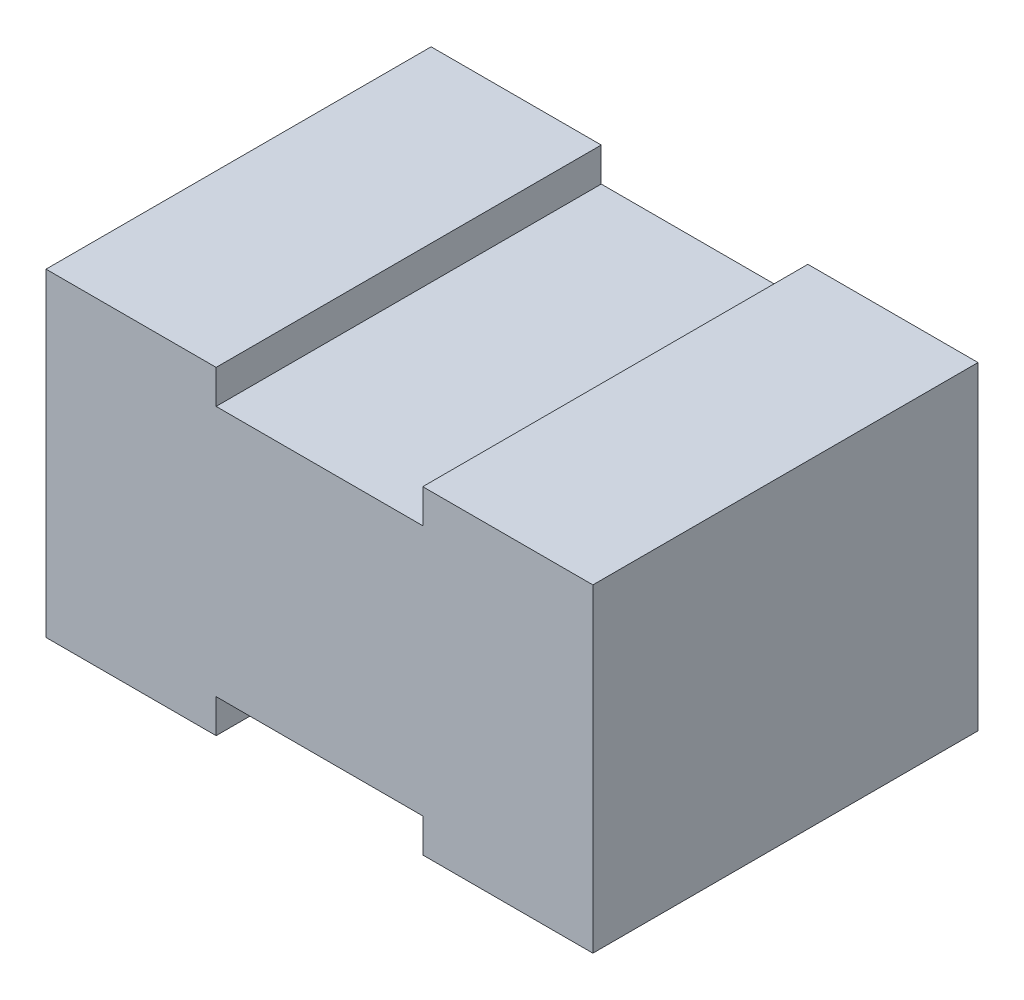
ISO-10303-21;
HEADER;
FILE_DESCRIPTION(('STEP AP214'),'2;1');
FILE_NAME('part.step','',(''),(''),'','','');
FILE_SCHEMA(('AUTOMOTIVE_DESIGN { 1 0 10303 214 1 1 1 1 }'));
ENDSEC;
DATA;
#1=APPLICATION_CONTEXT('core data for automotive mechanical design processes');
#2=APPLICATION_PROTOCOL_DEFINITION('international standard','automotive_design',2000,#1);
#3=PRODUCT_CONTEXT('',#1,'mechanical');
#4=PRODUCT('Part','Part','',(#3));
#5=PRODUCT_RELATED_PRODUCT_CATEGORY('part','',(#4));
#6=PRODUCT_DEFINITION_FORMATION('','',#4);
#7=PRODUCT_DEFINITION_CONTEXT('part definition',#1,'design');
#8=PRODUCT_DEFINITION('design','',#6,#7);
#9=PRODUCT_DEFINITION_SHAPE('','',#8);
#10=(LENGTH_UNIT() NAMED_UNIT(*) SI_UNIT(.MILLI.,.METRE.));
#11=(NAMED_UNIT(*) PLANE_ANGLE_UNIT() SI_UNIT($,.RADIAN.));
#12=(NAMED_UNIT(*) SI_UNIT($,.STERADIAN.) SOLID_ANGLE_UNIT());
#13=UNCERTAINTY_MEASURE_WITH_UNIT(LENGTH_MEASURE(1.E-05),#10,'distance_accuracy_value','');
#14=(GEOMETRIC_REPRESENTATION_CONTEXT(3) GLOBAL_UNCERTAINTY_ASSIGNED_CONTEXT((#13)) GLOBAL_UNIT_ASSIGNED_CONTEXT((#10,
#11,#12)) REPRESENTATION_CONTEXT('',''));
#15=CARTESIAN_POINT('',(0.,0.,0.));
#16=DIRECTION('',(0.,0.,1.));
#17=DIRECTION('',(1.,0.,0.));
#18=AXIS2_PLACEMENT_3D('',#15,#16,#17);
#19=CARTESIAN_POINT('',(0.,0.,0.45999908));
#20=DIRECTION('',(0.,0.,1.));
#21=DIRECTION('',(1.,0.,0.));
#22=AXIS2_PLACEMENT_3D('',#19,#20,#21);
#23=PLANE('',#22);
#24=DIRECTION('',(1.,0.,0.));
#25=VECTOR('',#24,1.);
#26=CARTESIAN_POINT('',(-0.12340082,0.15009876,0.459999080498));
#27=LINE('',#26,#25);
#28=CARTESIAN_POINT('',(-0.12340082,0.15009876,0.459999080498));
#29=VERTEX_POINT('',#28);
#30=CARTESIAN_POINT('',(0.12340082,0.15009876,0.459999080498));
#31=VERTEX_POINT('',#30);
#32=EDGE_CURVE('E223',#29,#31,#27,.T.);
#33=ORIENTED_EDGE('',*,*,#32,.F.);
#34=DIRECTION('',(0.,-1.,0.));
#35=VECTOR('',#34,1.);
#36=CARTESIAN_POINT('',(-0.12340082,0.1905,0.459999080498));
#37=LINE('',#36,#35);
#38=CARTESIAN_POINT('',(-0.12340082,0.1905,0.459999080498));
#39=VERTEX_POINT('',#38);
#40=EDGE_CURVE('E222',#39,#29,#37,.T.);
#41=ORIENTED_EDGE('',*,*,#40,.F.);
#42=DIRECTION('',(1.,0.,0.));
#43=VECTOR('',#42,1.);
#44=CARTESIAN_POINT('',(-0.32660082,0.1905,0.459999080498));
#45=LINE('',#44,#43);
#46=CARTESIAN_POINT('',(-0.32660082,0.1905,0.459999080498));
#47=VERTEX_POINT('',#46);
#48=EDGE_CURVE('E72',#47,#39,#45,.T.);
#49=ORIENTED_EDGE('',*,*,#48,.F.);
#50=DIRECTION('',(0.,1.,0.));
#51=VECTOR('',#50,1.);
#52=CARTESIAN_POINT('',(-0.32660082,-0.1905,0.459999080498));
#53=LINE('',#52,#51);
#54=CARTESIAN_POINT('',(-0.32660082,-0.1905,0.459999080498));
#55=VERTEX_POINT('',#54);
#56=EDGE_CURVE('E59',#55,#47,#53,.T.);
#57=ORIENTED_EDGE('',*,*,#56,.F.);
#58=DIRECTION('',(-1.,0.,0.));
#59=VECTOR('',#58,1.);
#60=CARTESIAN_POINT('',(-0.12340082,-0.1905,0.459999080498));
#61=LINE('',#60,#59);
#62=CARTESIAN_POINT('',(-0.12340082,-0.1905,0.459999080498));
#63=VERTEX_POINT('',#62);
#64=EDGE_CURVE('E240',#63,#55,#61,.T.);
#65=ORIENTED_EDGE('',*,*,#64,.F.);
#66=DIRECTION('',(0.,-1.,0.));
#67=VECTOR('',#66,1.);
#68=CARTESIAN_POINT('',(-0.12340082,-0.15009876,0.459999080498));
#69=LINE('',#68,#67);
#70=CARTESIAN_POINT('',(-0.12340082,-0.15009876,0.459999080498));
#71=VERTEX_POINT('',#70);
#72=EDGE_CURVE('E216',#71,#63,#69,.T.);
#73=ORIENTED_EDGE('',*,*,#72,.F.);
#74=DIRECTION('',(-1.,0.,0.));
#75=VECTOR('',#74,1.);
#76=CARTESIAN_POINT('',(0.12340082,-0.15009876,0.459999080498));
#77=LINE('',#76,#75);
#78=CARTESIAN_POINT('',(0.12340082,-0.15009876,0.459999080498));
#79=VERTEX_POINT('',#78);
#80=EDGE_CURVE('E154',#79,#71,#77,.T.);
#81=ORIENTED_EDGE('',*,*,#80,.F.);
#82=DIRECTION('',(0.,1.,0.));
#83=VECTOR('',#82,1.);
#84=CARTESIAN_POINT('',(0.12340082,-0.1905,0.459999080498));
#85=LINE('',#84,#83);
#86=CARTESIAN_POINT('',(0.12340082,-0.1905,0.459999080498));
#87=VERTEX_POINT('',#86);
#88=EDGE_CURVE('E149',#87,#79,#85,.T.);
#89=ORIENTED_EDGE('',*,*,#88,.F.);
#90=DIRECTION('',(-1.,0.,0.));
#91=VECTOR('',#90,1.);
#92=CARTESIAN_POINT('',(0.32660082,-0.1905,0.459999080498));
#93=LINE('',#92,#91);
#94=CARTESIAN_POINT('',(0.32660082,-0.1905,0.459999080498));
#95=VERTEX_POINT('',#94);
#96=EDGE_CURVE('E11',#95,#87,#93,.T.);
#97=ORIENTED_EDGE('',*,*,#96,.F.);
#98=DIRECTION('',(0.,-1.,0.));
#99=VECTOR('',#98,1.);
#100=CARTESIAN_POINT('',(0.32660082,0.190499999707,0.459999080498));
#101=LINE('',#100,#99);
#102=CARTESIAN_POINT('',(0.32660082,0.190499999707,0.459999080498));
#103=VERTEX_POINT('',#102);
#104=EDGE_CURVE('E183',#103,#95,#101,.T.);
#105=ORIENTED_EDGE('',*,*,#104,.F.);
#106=DIRECTION('',(1.,-1.441929198527E-09,0.));
#107=VECTOR('',#106,1.);
#108=CARTESIAN_POINT('',(0.12340082,0.1905,0.459999080498));
#109=LINE('',#108,#107);
#110=CARTESIAN_POINT('',(0.12340082,0.1905,0.459999080498));
#111=VERTEX_POINT('',#110);
#112=EDGE_CURVE('E187',#111,#103,#109,.T.);
#113=ORIENTED_EDGE('',*,*,#112,.F.);
#114=DIRECTION('',(0.,1.,0.));
#115=VECTOR('',#114,1.);
#116=CARTESIAN_POINT('',(0.12340082,0.15009876,0.459999080498));
#117=LINE('',#116,#115);
#118=EDGE_CURVE('E198',#31,#111,#117,.T.);
#119=ORIENTED_EDGE('',*,*,#118,.F.);
#120=EDGE_LOOP('',(#33,#41,#49,#57,#65,#73,#81,#89,#97,#105,#113,#119));
#121=FACE_BOUND('',#120,.T.);
#122=ADVANCED_FACE('F18',(#121),#23,.T.);
#123=CARTESIAN_POINT('',(0.12340082,-0.1905,0.));
#124=DIRECTION('',(0.,-1.,0.));
#125=DIRECTION('',(0.,0.,-1.));
#126=AXIS2_PLACEMENT_3D('',#123,#124,#125);
#127=PLANE('',#126);
#128=ORIENTED_EDGE('',*,*,#96,.T.);
#129=DIRECTION('',(3.036237963113E-10,-3.565224088822E-10,-1.));
#130=VECTOR('',#129,1.);
#131=CARTESIAN_POINT('',(0.12340082,-0.1905,0.459999080498));
#132=LINE('',#131,#130);
#133=CARTESIAN_POINT('',(0.1234008201397,-0.190500000164,0.));
#134=VERTEX_POINT('',#133);
#135=EDGE_CURVE('E29',#87,#134,#132,.T.);
#136=ORIENTED_EDGE('',*,*,#135,.T.);
#137=DIRECTION('',(-1.,0.,0.));
#138=VECTOR('',#137,1.);
#139=CARTESIAN_POINT('',(0.326600819942,-0.190500000164,0.));
#140=LINE('',#139,#138);
#141=CARTESIAN_POINT('',(0.326600819942,-0.190500000164,0.));
#142=VERTEX_POINT('',#141);
#143=EDGE_CURVE('E170',#142,#134,#140,.T.);
#144=ORIENTED_EDGE('',*,*,#143,.F.);
#145=DIRECTION('',(-1.260871948568E-10,-3.565224088822E-10,-1.));
#146=VECTOR('',#145,1.);
#147=CARTESIAN_POINT('',(0.32660082,-0.1905,0.459999080498));
#148=LINE('',#147,#146);
#149=EDGE_CURVE('E185',#95,#142,#148,.T.);
#150=ORIENTED_EDGE('',*,*,#149,.F.);
#151=EDGE_LOOP('',(#128,#136,#144,#150));
#152=FACE_BOUND('',#151,.T.);
#153=ADVANCED_FACE('F395',(#152),#127,.T.);
#154=CARTESIAN_POINT('',(0.12340082,-0.15009876,0.));
#155=DIRECTION('',(-1.,0.,0.));
#156=DIRECTION('',(0.,0.,1.));
#157=AXIS2_PLACEMENT_3D('',#154,#155,#156);
#158=PLANE('',#157);
#159=ORIENTED_EDGE('',*,*,#88,.T.);
#160=DIRECTION('',(3.036237963113E-10,2.311598773503E-10,-1.));
#161=VECTOR('',#160,1.);
#162=CARTESIAN_POINT('',(0.12340082,-0.15009876,0.459999080498));
#163=LINE('',#162,#161);
#164=CARTESIAN_POINT('',(0.1234008201397,-0.1500987598937,0.));
#165=VERTEX_POINT('',#164);
#166=EDGE_CURVE('E142',#79,#165,#163,.T.);
#167=ORIENTED_EDGE('',*,*,#166,.T.);
#168=DIRECTION('',(0.,1.,0.));
#169=VECTOR('',#168,1.);
#170=CARTESIAN_POINT('',(0.1234008201397,-0.190500000164,0.));
#171=LINE('',#170,#169);
#172=EDGE_CURVE('E146',#134,#165,#171,.T.);
#173=ORIENTED_EDGE('',*,*,#172,.F.);
#174=ORIENTED_EDGE('',*,*,#135,.F.);
#175=EDGE_LOOP('',(#159,#167,#173,#174));
#176=FACE_BOUND('',#175,.T.);
#177=ADVANCED_FACE('F144',(#176),#158,.T.);
#178=CARTESIAN_POINT('',(-0.12340082,-0.15009876,0.));
#179=DIRECTION('',(0.,-1.,0.));
#180=DIRECTION('',(0.,0.,-1.));
#181=AXIS2_PLACEMENT_3D('',#178,#179,#180);
#182=PLANE('',#181);
#183=ORIENTED_EDGE('',*,*,#80,.T.);
#184=DIRECTION('',(-3.036237963113E-10,2.311598773503E-10,-1.));
#185=VECTOR('',#184,1.);
#186=CARTESIAN_POINT('',(-0.12340082,-0.15009876,0.459999080498));
#187=LINE('',#186,#185);
#188=CARTESIAN_POINT('',(-0.1234008201397,-0.1500987598937,0.));
#189=VERTEX_POINT('',#188);
#190=EDGE_CURVE('E160',#71,#189,#187,.T.);
#191=ORIENTED_EDGE('',*,*,#190,.T.);
#192=DIRECTION('',(-1.,0.,0.));
#193=VECTOR('',#192,1.);
#194=CARTESIAN_POINT('',(0.1234008201397,-0.1500987598937,0.));
#195=LINE('',#194,#193);
#196=EDGE_CURVE('E157',#165,#189,#195,.T.);
#197=ORIENTED_EDGE('',*,*,#196,.F.);
#198=ORIENTED_EDGE('',*,*,#166,.F.);
#199=EDGE_LOOP('',(#183,#191,#197,#198));
#200=FACE_BOUND('',#199,.T.);
#201=ADVANCED_FACE('F158',(#200),#182,.T.);
#202=CARTESIAN_POINT('',(-0.12340082,-0.1905,0.));
#203=DIRECTION('',(1.,0.,0.));
#204=DIRECTION('',(0.,1.,0.));
#205=AXIS2_PLACEMENT_3D('',#202,#203,#204);
#206=PLANE('',#205);
#207=ORIENTED_EDGE('',*,*,#72,.T.);
#208=DIRECTION('',(-3.036237963113E-10,-3.565224088822E-10,-1.));
#209=VECTOR('',#208,1.);
#210=CARTESIAN_POINT('',(-0.12340082,-0.1905,0.459999080498));
#211=LINE('',#210,#209);
#212=CARTESIAN_POINT('',(-0.1234008201397,-0.190500000164,0.));
#213=VERTEX_POINT('',#212);
#214=EDGE_CURVE('E213',#63,#213,#211,.T.);
#215=ORIENTED_EDGE('',*,*,#214,.T.);
#216=DIRECTION('',(0.,-1.,0.));
#217=VECTOR('',#216,1.);
#218=CARTESIAN_POINT('',(-0.1234008201397,-0.1500987598937,0.));
#219=LINE('',#218,#217);
#220=EDGE_CURVE('E165',#189,#213,#219,.T.);
#221=ORIENTED_EDGE('',*,*,#220,.F.);
#222=ORIENTED_EDGE('',*,*,#190,.F.);
#223=EDGE_LOOP('',(#207,#215,#221,#222));
#224=FACE_BOUND('',#223,.T.);
#225=ADVANCED_FACE('F330',(#224),#206,.T.);
#226=CARTESIAN_POINT('',(-0.32660082,-0.1905,0.));
#227=DIRECTION('',(0.,-1.,0.));
#228=DIRECTION('',(0.,0.,-1.));
#229=AXIS2_PLACEMENT_3D('',#226,#227,#228);
#230=PLANE('',#229);
#231=ORIENTED_EDGE('',*,*,#64,.T.);
#232=DIRECTION('',(1.260871948568E-10,-3.565224088822E-10,-1.));
#233=VECTOR('',#232,1.);
#234=CARTESIAN_POINT('',(-0.32660082,-0.1905,0.459999080498));
#235=LINE('',#234,#233);
#236=CARTESIAN_POINT('',(-0.326600819942,-0.190500000164,0.));
#237=VERTEX_POINT('',#236);
#238=EDGE_CURVE('E243',#55,#237,#235,.T.);
#239=ORIENTED_EDGE('',*,*,#238,.T.);
#240=DIRECTION('',(-1.,0.,0.));
#241=VECTOR('',#240,1.);
#242=CARTESIAN_POINT('',(-0.1234008201397,-0.190500000164,0.));
#243=LINE('',#242,#241);
#244=EDGE_CURVE('E214',#213,#237,#243,.T.);
#245=ORIENTED_EDGE('',*,*,#244,.F.);
#246=ORIENTED_EDGE('',*,*,#214,.F.);
#247=EDGE_LOOP('',(#231,#239,#245,#246));
#248=FACE_BOUND('',#247,.T.);
#249=ADVANCED_FACE('F323',(#248),#230,.T.);
#250=CARTESIAN_POINT('',(-0.32660082,0.1905,0.));
#251=DIRECTION('',(-1.,0.,0.));
#252=DIRECTION('',(0.,0.,1.));
#253=AXIS2_PLACEMENT_3D('',#250,#251,#252);
#254=PLANE('',#253);
#255=ORIENTED_EDGE('',*,*,#56,.T.);
#256=DIRECTION('',(1.260871948568E-10,3.565224088822E-10,-1.));
#257=VECTOR('',#256,1.);
#258=CARTESIAN_POINT('',(-0.32660082,0.1905,0.459999080498));
#259=LINE('',#258,#257);
#260=CARTESIAN_POINT('',(-0.326600819942,0.190500000164,0.));
#261=VERTEX_POINT('',#260);
#262=EDGE_CURVE('E263',#47,#261,#259,.T.);
#263=ORIENTED_EDGE('',*,*,#262,.T.);
#264=DIRECTION('',(0.,1.,0.));
#265=VECTOR('',#264,1.);
#266=CARTESIAN_POINT('',(-0.326600819942,-0.190500000164,0.));
#267=LINE('',#266,#265);
#268=EDGE_CURVE('E236',#237,#261,#267,.T.);
#269=ORIENTED_EDGE('',*,*,#268,.F.);
#270=ORIENTED_EDGE('',*,*,#238,.F.);
#271=EDGE_LOOP('',(#255,#263,#269,#270));
#272=FACE_BOUND('',#271,.T.);
#273=ADVANCED_FACE('F329',(#272),#254,.T.);
#274=CARTESIAN_POINT('',(-0.12340082,0.1905,0.));
#275=DIRECTION('',(0.,1.,0.));
#276=DIRECTION('',(1.,0.,0.));
#277=AXIS2_PLACEMENT_3D('',#274,#275,#276);
#278=PLANE('',#277);
#279=ORIENTED_EDGE('',*,*,#48,.T.);
#280=DIRECTION('',(-3.036237963113E-10,3.565224088822E-10,-1.));
#281=VECTOR('',#280,1.);
#282=CARTESIAN_POINT('',(-0.12340082,0.1905,0.459999080498));
#283=LINE('',#282,#281);
#284=CARTESIAN_POINT('',(-0.1234008201397,0.190500000164,0.));
#285=VERTEX_POINT('',#284);
#286=EDGE_CURVE('E231',#39,#285,#283,.T.);
#287=ORIENTED_EDGE('',*,*,#286,.T.);
#288=DIRECTION('',(1.,0.,0.));
#289=VECTOR('',#288,1.);
#290=CARTESIAN_POINT('',(-0.326600819942,0.190500000164,0.));
#291=LINE('',#290,#289);
#292=EDGE_CURVE('E229',#261,#285,#291,.T.);
#293=ORIENTED_EDGE('',*,*,#292,.F.);
#294=ORIENTED_EDGE('',*,*,#262,.F.);
#295=EDGE_LOOP('',(#279,#287,#293,#294));
#296=FACE_BOUND('',#295,.T.);
#297=ADVANCED_FACE('F356',(#296),#278,.T.);
#298=CARTESIAN_POINT('',(-0.12340082,0.15009876,0.));
#299=DIRECTION('',(1.,0.,0.));
#300=DIRECTION('',(0.,1.,0.));
#301=AXIS2_PLACEMENT_3D('',#298,#299,#300);
#302=PLANE('',#301);
#303=ORIENTED_EDGE('',*,*,#40,.T.);
#304=DIRECTION('',(-3.036237963113E-10,-2.311598773503E-10,-1.));
#305=VECTOR('',#304,1.);
#306=CARTESIAN_POINT('',(-0.12340082,0.15009876,0.459999080498));
#307=LINE('',#306,#305);
#308=CARTESIAN_POINT('',(-0.1234008201397,0.1500987598937,0.));
#309=VERTEX_POINT('',#308);
#310=EDGE_CURVE('E219',#29,#309,#307,.T.);
#311=ORIENTED_EDGE('',*,*,#310,.T.);
#312=DIRECTION('',(0.,-1.,0.));
#313=VECTOR('',#312,1.);
#314=CARTESIAN_POINT('',(-0.1234008201397,0.190500000164,0.));
#315=LINE('',#314,#313);
#316=EDGE_CURVE('E224',#285,#309,#315,.T.);
#317=ORIENTED_EDGE('',*,*,#316,.F.);
#318=ORIENTED_EDGE('',*,*,#286,.F.);
#319=EDGE_LOOP('',(#303,#311,#317,#318));
#320=FACE_BOUND('',#319,.T.);
#321=ADVANCED_FACE('F20',(#320),#302,.T.);
#322=CARTESIAN_POINT('',(0.12340082,0.15009876,0.));
#323=DIRECTION('',(0.,1.,0.));
#324=DIRECTION('',(1.,0.,0.));
#325=AXIS2_PLACEMENT_3D('',#322,#323,#324);
#326=PLANE('',#325);
#327=ORIENTED_EDGE('',*,*,#32,.T.);
#328=DIRECTION('',(3.036237963113E-10,-2.311598773503E-10,-1.));
#329=VECTOR('',#328,1.);
#330=CARTESIAN_POINT('',(0.12340082,0.15009876,0.459999080498));
#331=LINE('',#330,#329);
#332=CARTESIAN_POINT('',(0.1234008201397,0.1500987598937,0.));
#333=VERTEX_POINT('',#332);
#334=EDGE_CURVE('E251',#31,#333,#331,.T.);
#335=ORIENTED_EDGE('',*,*,#334,.T.);
#336=DIRECTION('',(1.,0.,0.));
#337=VECTOR('',#336,1.);
#338=CARTESIAN_POINT('',(-0.1234008201397,0.1500987598937,0.));
#339=LINE('',#338,#337);
#340=EDGE_CURVE('E228',#309,#333,#339,.T.);
#341=ORIENTED_EDGE('',*,*,#340,.F.);
#342=ORIENTED_EDGE('',*,*,#310,.F.);
#343=EDGE_LOOP('',(#327,#335,#341,#342));
#344=FACE_BOUND('',#343,.T.);
#345=ADVANCED_FACE('F341',(#344),#326,.T.);
#346=CARTESIAN_POINT('',(0.12340082,0.1905,0.));
#347=DIRECTION('',(-1.,0.,0.));
#348=DIRECTION('',(0.,0.,1.));
#349=AXIS2_PLACEMENT_3D('',#346,#347,#348);
#350=PLANE('',#349);
#351=ORIENTED_EDGE('',*,*,#118,.T.);
#352=DIRECTION('',(3.036237963113E-10,3.565224088822E-10,-1.));
#353=VECTOR('',#352,1.);
#354=CARTESIAN_POINT('',(0.12340082,0.1905,0.459999080498));
#355=LINE('',#354,#353);
#356=CARTESIAN_POINT('',(0.1234008201397,0.190500000164,0.));
#357=VERTEX_POINT('',#356);
#358=EDGE_CURVE('E189',#111,#357,#355,.T.);
#359=ORIENTED_EDGE('',*,*,#358,.T.);
#360=DIRECTION('',(0.,1.,0.));
#361=VECTOR('',#360,1.);
#362=CARTESIAN_POINT('',(0.1234008201397,0.1500987598937,0.));
#363=LINE('',#362,#361);
#364=EDGE_CURVE('E252',#333,#357,#363,.T.);
#365=ORIENTED_EDGE('',*,*,#364,.F.);
#366=ORIENTED_EDGE('',*,*,#334,.F.);
#367=EDGE_LOOP('',(#351,#359,#365,#366));
#368=FACE_BOUND('',#367,.T.);
#369=ADVANCED_FACE('F346',(#368),#350,.T.);
#370=CARTESIAN_POINT('',(0.32660082,0.1905,0.));
#371=DIRECTION('',(0.,1.,0.));
#372=DIRECTION('',(1.,0.,0.));
#373=AXIS2_PLACEMENT_3D('',#370,#371,#372);
#374=PLANE('',#373);
#375=ORIENTED_EDGE('',*,*,#112,.T.);
#376=DIRECTION('',(-1.260871948568E-10,3.565224692205E-10,-1.));
#377=VECTOR('',#376,1.);
#378=CARTESIAN_POINT('',(0.32660082,0.190499999707,0.459999080498));
#379=LINE('',#378,#377);
#380=CARTESIAN_POINT('',(0.326600819942,0.190499999871,0.));
#381=VERTEX_POINT('',#380);
#382=EDGE_CURVE('E22',#103,#381,#379,.T.);
#383=ORIENTED_EDGE('',*,*,#382,.T.);
#384=DIRECTION('',(1.,-1.441929063337E-09,0.));
#385=VECTOR('',#384,1.);
#386=CARTESIAN_POINT('',(0.1234008201397,0.190500000164,0.));
#387=LINE('',#386,#385);
#388=EDGE_CURVE('E248',#357,#381,#387,.T.);
#389=ORIENTED_EDGE('',*,*,#388,.F.);
#390=ORIENTED_EDGE('',*,*,#358,.F.);
#391=EDGE_LOOP('',(#375,#383,#389,#390));
#392=FACE_BOUND('',#391,.T.);
#393=ADVANCED_FACE('F372',(#392),#374,.T.);
#394=CARTESIAN_POINT('',(0.32660082,-0.1905,0.));
#395=DIRECTION('',(1.,0.,0.));
#396=DIRECTION('',(0.,1.,0.));
#397=AXIS2_PLACEMENT_3D('',#394,#395,#396);
#398=PLANE('',#397);
#399=ORIENTED_EDGE('',*,*,#104,.T.);
#400=ORIENTED_EDGE('',*,*,#149,.T.);
#401=DIRECTION('',(0.,-1.,0.));
#402=VECTOR('',#401,1.);
#403=CARTESIAN_POINT('',(0.326600819942,0.190499999871,0.));
#404=LINE('',#403,#402);
#405=EDGE_CURVE('E186',#381,#142,#404,.T.);
#406=ORIENTED_EDGE('',*,*,#405,.F.);
#407=ORIENTED_EDGE('',*,*,#382,.F.);
#408=EDGE_LOOP('',(#399,#400,#406,#407));
#409=FACE_BOUND('',#408,.T.);
#410=ADVANCED_FACE('F367',(#409),#398,.T.);
#411=CARTESIAN_POINT('',(0.,0.,0.));
#412=DIRECTION('',(0.,0.,1.));
#413=DIRECTION('',(1.,0.,0.));
#414=AXIS2_PLACEMENT_3D('',#411,#412,#413);
#415=PLANE('',#414);
#416=ORIENTED_EDGE('',*,*,#143,.T.);
#417=ORIENTED_EDGE('',*,*,#172,.T.);
#418=ORIENTED_EDGE('',*,*,#196,.T.);
#419=ORIENTED_EDGE('',*,*,#220,.T.);
#420=ORIENTED_EDGE('',*,*,#244,.T.);
#421=ORIENTED_EDGE('',*,*,#268,.T.);
#422=ORIENTED_EDGE('',*,*,#292,.T.);
#423=ORIENTED_EDGE('',*,*,#316,.T.);
#424=ORIENTED_EDGE('',*,*,#340,.T.);
#425=ORIENTED_EDGE('',*,*,#364,.T.);
#426=ORIENTED_EDGE('',*,*,#388,.T.);
#427=ORIENTED_EDGE('',*,*,#405,.T.);
#428=EDGE_LOOP('',(#416,#417,#418,#419,#420,#421,#422,#423,#424,#425,#426,#427));
#429=FACE_BOUND('',#428,.T.);
#430=ADVANCED_FACE('F167',(#429),#415,.F.);
#431=CLOSED_SHELL('',(#122,#153,#177,#201,#225,#249,#273,#297,#321,#345,#369,#393,#410,#430));
#432=MANIFOLD_SOLID_BREP('B1',#431);
#433=ADVANCED_BREP_SHAPE_REPRESENTATION('',(#18,#432),#14);
#434=SHAPE_DEFINITION_REPRESENTATION(#9,#433);
ENDSEC;
END-ISO-10303-21;
